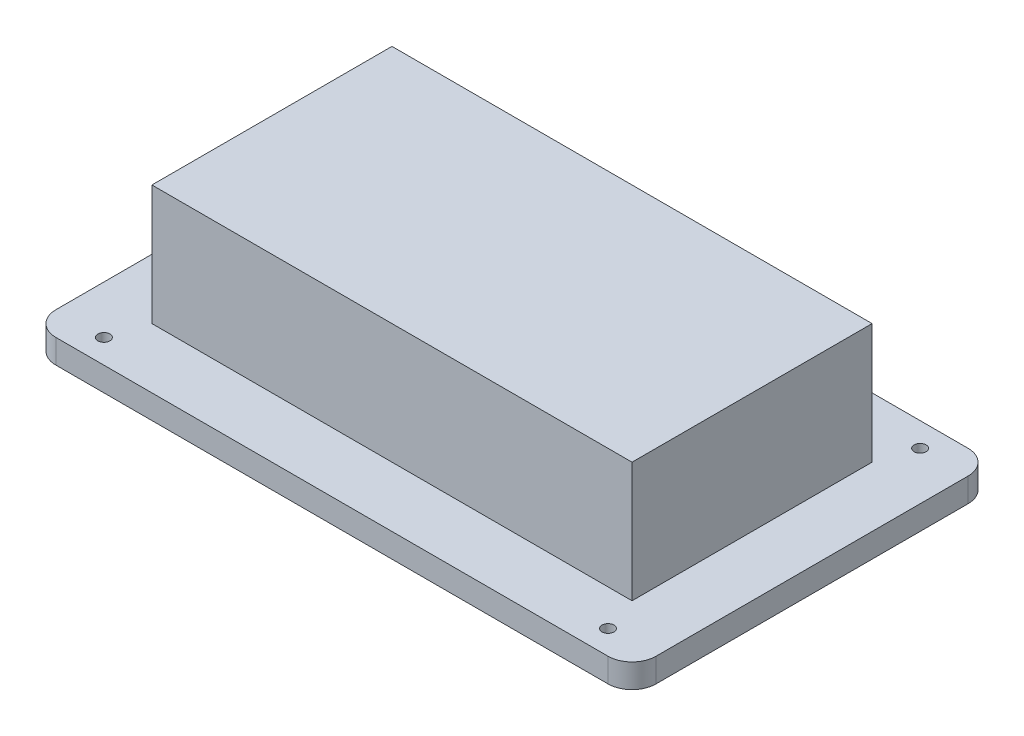
ISO-10303-21;
HEADER;
FILE_DESCRIPTION(('STEP AP214'),'2;1');
FILE_NAME('part.step','',(''),(''),'','','');
FILE_SCHEMA(('AUTOMOTIVE_DESIGN { 1 0 10303 214 1 1 1 1 }'));
ENDSEC;
DATA;
#1=APPLICATION_CONTEXT('core data for automotive mechanical design processes');
#2=APPLICATION_PROTOCOL_DEFINITION('international standard','automotive_design',2000,#1);
#3=PRODUCT_CONTEXT('',#1,'mechanical');
#4=PRODUCT('Part','Part','',(#3));
#5=PRODUCT_RELATED_PRODUCT_CATEGORY('part','',(#4));
#6=PRODUCT_DEFINITION_FORMATION('','',#4);
#7=PRODUCT_DEFINITION_CONTEXT('part definition',#1,'design');
#8=PRODUCT_DEFINITION('design','',#6,#7);
#9=PRODUCT_DEFINITION_SHAPE('','',#8);
#10=(LENGTH_UNIT() NAMED_UNIT(*) SI_UNIT(.MILLI.,.METRE.));
#11=(NAMED_UNIT(*) PLANE_ANGLE_UNIT() SI_UNIT($,.RADIAN.));
#12=(NAMED_UNIT(*) SI_UNIT($,.STERADIAN.) SOLID_ANGLE_UNIT());
#13=UNCERTAINTY_MEASURE_WITH_UNIT(LENGTH_MEASURE(1.E-05),#10,'distance_accuracy_value','');
#14=(GEOMETRIC_REPRESENTATION_CONTEXT(3) GLOBAL_UNCERTAINTY_ASSIGNED_CONTEXT((#13)) GLOBAL_UNIT_ASSIGNED_CONTEXT((#10,
#11,#12)) REPRESENTATION_CONTEXT('',''));
#15=CARTESIAN_POINT('',(0.,0.,0.));
#16=DIRECTION('',(0.,0.,1.));
#17=DIRECTION('',(1.,0.,0.));
#18=AXIS2_PLACEMENT_3D('',#15,#16,#17);
#19=CARTESIAN_POINT('',(125.,9.99999999999995,-75.0000000000001));
#20=DIRECTION('',(-1.,0.,0.));
#21=DIRECTION('',(0.,0.,1.));
#22=AXIS2_PLACEMENT_3D('',#19,#20,#21);
#23=PLANE('',#22);
#24=DIRECTION('',(0.,0.,-1.));
#25=VECTOR('',#24,1.);
#26=CARTESIAN_POINT('',(125.,0.,-75.));
#27=LINE('',#26,#25);
#28=CARTESIAN_POINT('',(125.,0.,64.9999999999953));
#29=VERTEX_POINT('',#28);
#30=CARTESIAN_POINT('',(125.,0.,-64.9999999999999));
#31=VERTEX_POINT('',#30);
#32=EDGE_CURVE('E159',#29,#31,#27,.T.);
#33=ORIENTED_EDGE('',*,*,#32,.T.);
#34=DIRECTION('',(0.,-1.,0.));
#35=VECTOR('',#34,1.);
#36=CARTESIAN_POINT('',(125.,10.,-65.0000000000001));
#37=LINE('',#36,#35);
#38=CARTESIAN_POINT('',(125.,10.,-65.0000000000001));
#39=VERTEX_POINT('',#38);
#40=EDGE_CURVE('E240',#31,#39,#37,.F.);
#41=ORIENTED_EDGE('',*,*,#40,.T.);
#42=DIRECTION('',(0.,0.,-1.));
#43=VECTOR('',#42,1.);
#44=CARTESIAN_POINT('',(125.,9.99999999999995,-75.0000000000001));
#45=LINE('',#44,#43);
#46=CARTESIAN_POINT('',(125.,10.,64.9999999999955));
#47=VERTEX_POINT('',#46);
#48=EDGE_CURVE('E171',#47,#39,#45,.T.);
#49=ORIENTED_EDGE('',*,*,#48,.F.);
#50=DIRECTION('',(0.,-1.,0.));
#51=VECTOR('',#50,1.);
#52=CARTESIAN_POINT('',(125.,10.,64.9999999999955));
#53=LINE('',#52,#51);
#54=EDGE_CURVE('E236',#47,#29,#53,.T.);
#55=ORIENTED_EDGE('',*,*,#54,.T.);
#56=EDGE_LOOP('',(#33,#41,#49,#55));
#57=FACE_BOUND('',#56,.T.);
#58=ADVANCED_FACE('F45',(#57),#23,.F.);
#59=CARTESIAN_POINT('',(-124.999999999999,10.,-75.0000000000024));
#60=DIRECTION('',(0.,0.,1.));
#61=DIRECTION('',(1.,0.,0.));
#62=AXIS2_PLACEMENT_3D('',#59,#60,#61);
#63=PLANE('',#62);
#64=DIRECTION('',(-1.,0.,0.));
#65=VECTOR('',#64,1.);
#66=CARTESIAN_POINT('',(-125.,0.,-75.0000000000001));
#67=LINE('',#66,#65);
#68=CARTESIAN_POINT('',(115.,0.,-75.0000000000001));
#69=VERTEX_POINT('',#68);
#70=CARTESIAN_POINT('',(-115.,0.,-75.));
#71=VERTEX_POINT('',#70);
#72=EDGE_CURVE('E165',#69,#71,#67,.T.);
#73=ORIENTED_EDGE('',*,*,#72,.T.);
#74=DIRECTION('',(0.,-1.,0.));
#75=VECTOR('',#74,1.);
#76=CARTESIAN_POINT('',(-114.999999999999,10.,-75.0000000000003));
#77=LINE('',#76,#75);
#78=CARTESIAN_POINT('',(-114.999999999999,10.,-75.0000000000003));
#79=VERTEX_POINT('',#78);
#80=EDGE_CURVE('E221',#71,#79,#77,.F.);
#81=ORIENTED_EDGE('',*,*,#80,.T.);
#82=DIRECTION('',(-1.,0.,0.));
#83=VECTOR('',#82,1.);
#84=CARTESIAN_POINT('',(-124.999999999999,10.,-75.0000000000024));
#85=LINE('',#84,#83);
#86=CARTESIAN_POINT('',(115.,10.,-75.0000000000024));
#87=VERTEX_POINT('',#86);
#88=EDGE_CURVE('E175',#87,#79,#85,.T.);
#89=ORIENTED_EDGE('',*,*,#88,.F.);
#90=DIRECTION('',(0.,-1.,0.));
#91=VECTOR('',#90,1.);
#92=CARTESIAN_POINT('',(115.,10.,-75.0000000000024));
#93=LINE('',#92,#91);
#94=EDGE_CURVE('E217',#87,#69,#93,.T.);
#95=ORIENTED_EDGE('',*,*,#94,.T.);
#96=EDGE_LOOP('',(#73,#81,#89,#95));
#97=FACE_BOUND('',#96,.T.);
#98=ADVANCED_FACE('F329',(#97),#63,.F.);
#99=CARTESIAN_POINT('',(-124.999999999999,10.,-75.0000000000024));
#100=DIRECTION('',(1.,0.,0.));
#101=DIRECTION('',(0.,0.,-1.));
#102=AXIS2_PLACEMENT_3D('',#99,#100,#101);
#103=PLANE('',#102);
#104=DIRECTION('',(0.,0.,1.));
#105=VECTOR('',#104,1.);
#106=CARTESIAN_POINT('',(-124.999999999999,10.,-75.0000000000024));
#107=LINE('',#106,#105);
#108=CARTESIAN_POINT('',(-124.999999999999,10.,-65.0000000000024));
#109=VERTEX_POINT('',#108);
#110=CARTESIAN_POINT('',(-125.,10.,65.0000000000002));
#111=VERTEX_POINT('',#110);
#112=EDGE_CURVE('E180',#109,#111,#107,.T.);
#113=ORIENTED_EDGE('',*,*,#112,.F.);
#114=DIRECTION('',(0.,-1.,0.));
#115=VECTOR('',#114,1.);
#116=CARTESIAN_POINT('',(-124.999999999999,10.,-65.0000000000024));
#117=LINE('',#116,#115);
#118=CARTESIAN_POINT('',(-125.,0.,-65.0000000000001));
#119=VERTEX_POINT('',#118);
#120=EDGE_CURVE('E201',#109,#119,#117,.T.);
#121=ORIENTED_EDGE('',*,*,#120,.T.);
#122=DIRECTION('',(0.,0.,1.));
#123=VECTOR('',#122,1.);
#124=CARTESIAN_POINT('',(-125.,0.,-75.0000000000001));
#125=LINE('',#124,#123);
#126=CARTESIAN_POINT('',(-125.,0.,64.9999999999997));
#127=VERTEX_POINT('',#126);
#128=EDGE_CURVE('E192',#119,#127,#125,.T.);
#129=ORIENTED_EDGE('',*,*,#128,.T.);
#130=DIRECTION('',(0.,-1.,0.));
#131=VECTOR('',#130,1.);
#132=CARTESIAN_POINT('',(-125.,10.,65.0000000000002));
#133=LINE('',#132,#131);
#134=EDGE_CURVE('E187',#127,#111,#133,.F.);
#135=ORIENTED_EDGE('',*,*,#134,.T.);
#136=EDGE_LOOP('',(#113,#121,#129,#135));
#137=FACE_BOUND('',#136,.T.);
#138=ADVANCED_FACE('F308',(#137),#103,.F.);
#139=CARTESIAN_POINT('',(-125.,9.9999999999999,75.));
#140=DIRECTION('',(0.,0.,-1.));
#141=DIRECTION('',(-1.,0.,0.));
#142=AXIS2_PLACEMENT_3D('',#139,#140,#141);
#143=PLANE('',#142);
#144=DIRECTION('',(1.,0.,0.));
#145=VECTOR('',#144,1.);
#146=CARTESIAN_POINT('',(-125.,-1.22124532708767E-12,74.9999999999997));
#147=LINE('',#146,#145);
#148=CARTESIAN_POINT('',(-115.,0.,74.9999999999953));
#149=VERTEX_POINT('',#148);
#150=CARTESIAN_POINT('',(115.,0.,74.9999999999997));
#151=VERTEX_POINT('',#150);
#152=EDGE_CURVE('E176',#149,#151,#147,.T.);
#153=ORIENTED_EDGE('',*,*,#152,.T.);
#154=DIRECTION('',(0.,-1.,0.));
#155=VECTOR('',#154,1.);
#156=CARTESIAN_POINT('',(115.,10.,75.0000000000002));
#157=LINE('',#156,#155);
#158=CARTESIAN_POINT('',(115.,10.,75.0000000000002));
#159=VERTEX_POINT('',#158);
#160=EDGE_CURVE('E11',#151,#159,#157,.F.);
#161=ORIENTED_EDGE('',*,*,#160,.T.);
#162=DIRECTION('',(1.,0.,0.));
#163=VECTOR('',#162,1.);
#164=CARTESIAN_POINT('',(-125.,9.9999999999999,75.));
#165=LINE('',#164,#163);
#166=CARTESIAN_POINT('',(-114.999999999999,10.,74.9999999999953));
#167=VERTEX_POINT('',#166);
#168=EDGE_CURVE('E184',#167,#159,#165,.T.);
#169=ORIENTED_EDGE('',*,*,#168,.F.);
#170=DIRECTION('',(0.,-1.,0.));
#171=VECTOR('',#170,1.);
#172=CARTESIAN_POINT('',(-114.999999999999,10.,74.9999999999953));
#173=LINE('',#172,#171);
#174=EDGE_CURVE('E55',#167,#149,#173,.T.);
#175=ORIENTED_EDGE('',*,*,#174,.T.);
#176=EDGE_LOOP('',(#153,#161,#169,#175));
#177=FACE_BOUND('',#176,.T.);
#178=ADVANCED_FACE('F293',(#177),#143,.F.);
#179=CARTESIAN_POINT('',(0.,10.,-2.44249065417534E-12));
#180=DIRECTION('',(0.,1.,0.));
#181=DIRECTION('',(0.,0.,1.));
#182=AXIS2_PLACEMENT_3D('',#179,#180,#181);
#183=PLANE('',#182);
#184=CARTESIAN_POINT('',(105.,10.,-65.0000000000004));
#185=DIRECTION('',(0.,1.,0.));
#186=DIRECTION('',(0.,0.,1.));
#187=AXIS2_PLACEMENT_3D('',#184,#185,#186);
#188=CIRCLE('',#187,2.49999999999999);
#189=CARTESIAN_POINT('',(105.,10.,-62.5000000000004));
#190=VERTEX_POINT('',#189);
#191=EDGE_CURVE('E493',#190,#190,#188,.T.);
#192=ORIENTED_EDGE('',*,*,#191,.F.);
#193=EDGE_LOOP('',(#192));
#194=FACE_BOUND('',#193,.T.);
#195=CARTESIAN_POINT('',(-104.999999999999,10.,-65.0000000000024));
#196=DIRECTION('',(0.,1.,0.));
#197=DIRECTION('',(0.,0.,1.));
#198=AXIS2_PLACEMENT_3D('',#195,#196,#197);
#199=CIRCLE('',#198,2.49999999999999);
#200=CARTESIAN_POINT('',(-104.999999999999,10.,-62.5000000000024));
#201=VERTEX_POINT('',#200);
#202=EDGE_CURVE('E497',#201,#201,#199,.T.);
#203=ORIENTED_EDGE('',*,*,#202,.F.);
#204=EDGE_LOOP('',(#203));
#205=FACE_BOUND('',#204,.T.);
#206=CARTESIAN_POINT('',(105.,10.,64.9999999999997));
#207=DIRECTION('',(0.,1.,0.));
#208=DIRECTION('',(0.,0.,1.));
#209=AXIS2_PLACEMENT_3D('',#206,#207,#208);
#210=CIRCLE('',#209,2.49999999999999);
#211=CARTESIAN_POINT('',(105.,10.,67.4999999999997));
#212=VERTEX_POINT('',#211);
#213=EDGE_CURVE('E264',#212,#212,#210,.T.);
#214=ORIENTED_EDGE('',*,*,#213,.F.);
#215=EDGE_LOOP('',(#214));
#216=FACE_BOUND('',#215,.T.);
#217=CARTESIAN_POINT('',(-104.999999999999,9.99999999999879,64.9999999999997));
#218=DIRECTION('',(0.,1.,0.));
#219=DIRECTION('',(0.,0.,1.));
#220=AXIS2_PLACEMENT_3D('',#217,#218,#219);
#221=CIRCLE('',#220,2.49999999999999);
#222=CARTESIAN_POINT('',(-104.999999999999,9.99999999999879,67.4999999999997));
#223=VERTEX_POINT('',#222);
#224=EDGE_CURVE('E248',#223,#223,#221,.T.);
#225=ORIENTED_EDGE('',*,*,#224,.F.);
#226=EDGE_LOOP('',(#225));
#227=FACE_BOUND('',#226,.T.);
#228=DIRECTION('',(0.,0.,-1.));
#229=VECTOR('',#228,1.);
#230=CARTESIAN_POINT('',(99.9999999999999,10.,49.9999999999996));
#231=LINE('',#230,#229);
#232=CARTESIAN_POINT('',(99.9999999999999,10.,49.9999999999996));
#233=VERTEX_POINT('',#232);
#234=CARTESIAN_POINT('',(99.9999999999999,10.,-50.0000000000024));
#235=VERTEX_POINT('',#234);
#236=EDGE_CURVE('E63',#233,#235,#231,.T.);
#237=ORIENTED_EDGE('',*,*,#236,.F.);
#238=DIRECTION('',(1.,0.,0.));
#239=VECTOR('',#238,1.);
#240=CARTESIAN_POINT('',(-100.,10.,49.9999999999996));
#241=LINE('',#240,#239);
#242=CARTESIAN_POINT('',(-100.,10.,49.9999999999996));
#243=VERTEX_POINT('',#242);
#244=EDGE_CURVE('E67',#243,#233,#241,.T.);
#245=ORIENTED_EDGE('',*,*,#244,.F.);
#246=DIRECTION('',(0.,0.,1.));
#247=VECTOR('',#246,1.);
#248=CARTESIAN_POINT('',(-100.,10.,49.9999999999996));
#249=LINE('',#248,#247);
#250=CARTESIAN_POINT('',(-100.,10.,-50.0000000000024));
#251=VERTEX_POINT('',#250);
#252=EDGE_CURVE('E275',#251,#243,#249,.T.);
#253=ORIENTED_EDGE('',*,*,#252,.F.);
#254=DIRECTION('',(-1.,0.,0.));
#255=VECTOR('',#254,1.);
#256=CARTESIAN_POINT('',(-100.,10.,-50.0000000000024));
#257=LINE('',#256,#255);
#258=EDGE_CURVE('E254',#235,#251,#257,.T.);
#259=ORIENTED_EDGE('',*,*,#258,.F.);
#260=EDGE_LOOP('',(#237,#245,#253,#259));
#261=FACE_BOUND('',#260,.T.);
#262=ORIENTED_EDGE('',*,*,#88,.T.);
#263=CARTESIAN_POINT('',(-114.999999999999,9.99999999999879,-65.0000000000003));
#264=DIRECTION('',(0.,1.,0.));
#265=DIRECTION('',(0.,0.,1.));
#266=AXIS2_PLACEMENT_3D('',#263,#264,#265);
#267=CIRCLE('',#266,10.);
#268=EDGE_CURVE('E233',#79,#109,#267,.T.);
#269=ORIENTED_EDGE('',*,*,#268,.T.);
#270=ORIENTED_EDGE('',*,*,#112,.T.);
#271=CARTESIAN_POINT('',(-114.999999999999,10.,64.9999999999955));
#272=DIRECTION('',(0.,1.,0.));
#273=DIRECTION('',(0.,0.,1.));
#274=AXIS2_PLACEMENT_3D('',#271,#272,#273);
#275=CIRCLE('',#274,10.);
#276=EDGE_CURVE('E224',#111,#167,#275,.T.);
#277=ORIENTED_EDGE('',*,*,#276,.T.);
#278=ORIENTED_EDGE('',*,*,#168,.T.);
#279=CARTESIAN_POINT('',(115.,10.,65.0000000000002));
#280=DIRECTION('',(0.,1.,0.));
#281=DIRECTION('',(0.,0.,1.));
#282=AXIS2_PLACEMENT_3D('',#279,#280,#281);
#283=CIRCLE('',#282,10.);
#284=EDGE_CURVE('E227',#159,#47,#283,.T.);
#285=ORIENTED_EDGE('',*,*,#284,.T.);
#286=ORIENTED_EDGE('',*,*,#48,.T.);
#287=CARTESIAN_POINT('',(115.,9.99999999999879,-65.0000000000024));
#288=DIRECTION('',(0.,1.,0.));
#289=DIRECTION('',(0.,0.,1.));
#290=AXIS2_PLACEMENT_3D('',#287,#288,#289);
#291=CIRCLE('',#290,10.);
#292=EDGE_CURVE('E230',#39,#87,#291,.T.);
#293=ORIENTED_EDGE('',*,*,#292,.T.);
#294=EDGE_LOOP('',(#262,#269,#270,#277,#278,#285,#286,#293));
#295=FACE_BOUND('',#294,.T.);
#296=ADVANCED_FACE('F289',(#194,#205,#216,#227,#261,#295),#183,.T.);
#297=CARTESIAN_POINT('',(0.,0.,0.));
#298=DIRECTION('',(0.,1.,0.));
#299=DIRECTION('',(0.,0.,1.));
#300=AXIS2_PLACEMENT_3D('',#297,#298,#299);
#301=PLANE('',#300);
#302=CARTESIAN_POINT('',(105.,0.,-64.9999999999999));
#303=DIRECTION('',(0.,1.,0.));
#304=DIRECTION('',(0.,0.,1.));
#305=AXIS2_PLACEMENT_3D('',#302,#303,#304);
#306=CIRCLE('',#305,2.49999999999999);
#307=CARTESIAN_POINT('',(105.,0.,-62.5));
#308=VERTEX_POINT('',#307);
#309=EDGE_CURVE('E49',#308,#308,#306,.T.);
#310=ORIENTED_EDGE('',*,*,#309,.T.);
#311=EDGE_LOOP('',(#310));
#312=FACE_BOUND('',#311,.T.);
#313=CARTESIAN_POINT('',(-105.,0.,-65.0000000000001));
#314=DIRECTION('',(0.,1.,0.));
#315=DIRECTION('',(0.,0.,1.));
#316=AXIS2_PLACEMENT_3D('',#313,#314,#315);
#317=CIRCLE('',#316,2.49999999999999);
#318=CARTESIAN_POINT('',(-105.,0.,-62.5000000000001));
#319=VERTEX_POINT('',#318);
#320=EDGE_CURVE('E502',#319,#319,#317,.T.);
#321=ORIENTED_EDGE('',*,*,#320,.T.);
#322=EDGE_LOOP('',(#321));
#323=FACE_BOUND('',#322,.T.);
#324=CARTESIAN_POINT('',(105.,0.,64.9999999999997));
#325=DIRECTION('',(0.,1.,0.));
#326=DIRECTION('',(0.,0.,1.));
#327=AXIS2_PLACEMENT_3D('',#324,#325,#326);
#328=CIRCLE('',#327,2.49999999999999);
#329=CARTESIAN_POINT('',(105.,0.,67.4999999999997));
#330=VERTEX_POINT('',#329);
#331=EDGE_CURVE('E257',#330,#330,#328,.T.);
#332=ORIENTED_EDGE('',*,*,#331,.T.);
#333=EDGE_LOOP('',(#332));
#334=FACE_BOUND('',#333,.T.);
#335=CARTESIAN_POINT('',(-105.,-1.22124532708767E-12,64.9999999999953));
#336=DIRECTION('',(0.,1.,0.));
#337=DIRECTION('',(0.,0.,1.));
#338=AXIS2_PLACEMENT_3D('',#335,#336,#337);
#339=CIRCLE('',#338,2.49999999999999);
#340=CARTESIAN_POINT('',(-105.,-1.22124532708772E-12,67.4999999999953));
#341=VERTEX_POINT('',#340);
#342=EDGE_CURVE('E245',#341,#341,#339,.T.);
#343=ORIENTED_EDGE('',*,*,#342,.T.);
#344=EDGE_LOOP('',(#343));
#345=FACE_BOUND('',#344,.T.);
#346=ORIENTED_EDGE('',*,*,#128,.F.);
#347=CARTESIAN_POINT('',(-115.,-1.22124532708767E-12,-64.9999999999999));
#348=DIRECTION('',(0.,1.,0.));
#349=DIRECTION('',(0.,0.,1.));
#350=AXIS2_PLACEMENT_3D('',#347,#348,#349);
#351=CIRCLE('',#350,10.);
#352=EDGE_CURVE('E214',#119,#71,#351,.F.);
#353=ORIENTED_EDGE('',*,*,#352,.T.);
#354=ORIENTED_EDGE('',*,*,#72,.F.);
#355=CARTESIAN_POINT('',(115.,-1.22124532708767E-12,-65.0000000000001));
#356=DIRECTION('',(0.,1.,0.));
#357=DIRECTION('',(0.,0.,1.));
#358=AXIS2_PLACEMENT_3D('',#355,#356,#357);
#359=CIRCLE('',#358,10.);
#360=EDGE_CURVE('E211',#69,#31,#359,.F.);
#361=ORIENTED_EDGE('',*,*,#360,.T.);
#362=ORIENTED_EDGE('',*,*,#32,.F.);
#363=CARTESIAN_POINT('',(115.,0.,64.9999999999997));
#364=DIRECTION('',(0.,1.,0.));
#365=DIRECTION('',(0.,0.,1.));
#366=AXIS2_PLACEMENT_3D('',#363,#364,#365);
#367=CIRCLE('',#366,10.);
#368=EDGE_CURVE('E208',#29,#151,#367,.F.);
#369=ORIENTED_EDGE('',*,*,#368,.T.);
#370=ORIENTED_EDGE('',*,*,#152,.F.);
#371=CARTESIAN_POINT('',(-115.,0.,64.9999999999953));
#372=DIRECTION('',(0.,1.,0.));
#373=DIRECTION('',(0.,0.,1.));
#374=AXIS2_PLACEMENT_3D('',#371,#372,#373);
#375=CIRCLE('',#374,10.);
#376=EDGE_CURVE('E205',#149,#127,#375,.F.);
#377=ORIENTED_EDGE('',*,*,#376,.T.);
#378=EDGE_LOOP('',(#346,#353,#354,#361,#362,#369,#370,#377));
#379=FACE_BOUND('',#378,.T.);
#380=ADVANCED_FACE('F292',(#312,#323,#334,#345,#379),#301,.F.);
#381=CARTESIAN_POINT('',(-114.999999999999,9.99999999999879,-65.0000000000003));
#382=DIRECTION('',(0.,-1.,0.));
#383=DIRECTION('',(0.,0.,-1.));
#384=AXIS2_PLACEMENT_3D('',#381,#382,#383);
#385=CYLINDRICAL_SURFACE('',#384,10.);
#386=ORIENTED_EDGE('',*,*,#268,.F.);
#387=ORIENTED_EDGE('',*,*,#80,.F.);
#388=ORIENTED_EDGE('',*,*,#352,.F.);
#389=ORIENTED_EDGE('',*,*,#120,.F.);
#390=EDGE_LOOP('',(#386,#387,#388,#389));
#391=FACE_BOUND('',#390,.T.);
#392=ADVANCED_FACE('F305',(#391),#385,.T.);
#393=CARTESIAN_POINT('',(115.,9.99999999999879,-65.0000000000024));
#394=DIRECTION('',(0.,-1.,0.));
#395=DIRECTION('',(0.,0.,-1.));
#396=AXIS2_PLACEMENT_3D('',#393,#394,#395);
#397=CYLINDRICAL_SURFACE('',#396,10.);
#398=ORIENTED_EDGE('',*,*,#292,.F.);
#399=ORIENTED_EDGE('',*,*,#40,.F.);
#400=ORIENTED_EDGE('',*,*,#360,.F.);
#401=ORIENTED_EDGE('',*,*,#94,.F.);
#402=EDGE_LOOP('',(#398,#399,#400,#401));
#403=FACE_BOUND('',#402,.T.);
#404=ADVANCED_FACE('F328',(#403),#397,.T.);
#405=CARTESIAN_POINT('',(115.,10.,65.0000000000002));
#406=DIRECTION('',(0.,-1.,0.));
#407=DIRECTION('',(0.,0.,-1.));
#408=AXIS2_PLACEMENT_3D('',#405,#406,#407);
#409=CYLINDRICAL_SURFACE('',#408,10.);
#410=ORIENTED_EDGE('',*,*,#284,.F.);
#411=ORIENTED_EDGE('',*,*,#160,.F.);
#412=ORIENTED_EDGE('',*,*,#368,.F.);
#413=ORIENTED_EDGE('',*,*,#54,.F.);
#414=EDGE_LOOP('',(#410,#411,#412,#413));
#415=FACE_BOUND('',#414,.T.);
#416=ADVANCED_FACE('F323',(#415),#409,.T.);
#417=CARTESIAN_POINT('',(-114.999999999999,10.,64.9999999999955));
#418=DIRECTION('',(0.,-1.,0.));
#419=DIRECTION('',(0.,0.,-1.));
#420=AXIS2_PLACEMENT_3D('',#417,#418,#419);
#421=CYLINDRICAL_SURFACE('',#420,10.);
#422=ORIENTED_EDGE('',*,*,#276,.F.);
#423=ORIENTED_EDGE('',*,*,#134,.F.);
#424=ORIENTED_EDGE('',*,*,#376,.F.);
#425=ORIENTED_EDGE('',*,*,#174,.F.);
#426=EDGE_LOOP('',(#422,#423,#424,#425));
#427=FACE_BOUND('',#426,.T.);
#428=ADVANCED_FACE('F47',(#427),#421,.T.);
#429=CARTESIAN_POINT('',(100.,60.,50.0000000000003));
#430=DIRECTION('',(-1.,0.,0.));
#431=DIRECTION('',(0.,0.,1.));
#432=AXIS2_PLACEMENT_3D('',#429,#430,#431);
#433=PLANE('',#432);
#434=ORIENTED_EDGE('',*,*,#236,.T.);
#435=DIRECTION('',(0.,-1.,0.));
#436=VECTOR('',#435,1.);
#437=CARTESIAN_POINT('',(100.,60.,-50.));
#438=LINE('',#437,#436);
#439=CARTESIAN_POINT('',(100.,60.,-50.));
#440=VERTEX_POINT('',#439);
#441=EDGE_CURVE('E139',#440,#235,#438,.T.);
#442=ORIENTED_EDGE('',*,*,#441,.F.);
#443=DIRECTION('',(0.,0.,-1.));
#444=VECTOR('',#443,1.);
#445=CARTESIAN_POINT('',(100.,60.,50.0000000000003));
#446=LINE('',#445,#444);
#447=CARTESIAN_POINT('',(100.,60.,50.0000000000003));
#448=VERTEX_POINT('',#447);
#449=EDGE_CURVE('E146',#448,#440,#446,.T.);
#450=ORIENTED_EDGE('',*,*,#449,.F.);
#451=DIRECTION('',(0.,-1.,0.));
#452=VECTOR('',#451,1.);
#453=CARTESIAN_POINT('',(100.,60.,50.0000000000003));
#454=LINE('',#453,#452);
#455=EDGE_CURVE('E271',#448,#233,#454,.T.);
#456=ORIENTED_EDGE('',*,*,#455,.T.);
#457=EDGE_LOOP('',(#434,#442,#450,#456));
#458=FACE_BOUND('',#457,.T.);
#459=ADVANCED_FACE('F157',(#458),#433,.F.);
#460=CARTESIAN_POINT('',(-100.,60.,-50.0000000000004));
#461=DIRECTION('',(0.,0.,1.));
#462=DIRECTION('',(1.,0.,0.));
#463=AXIS2_PLACEMENT_3D('',#460,#461,#462);
#464=PLANE('',#463);
#465=ORIENTED_EDGE('',*,*,#258,.T.);
#466=DIRECTION('',(0.,-1.,0.));
#467=VECTOR('',#466,1.);
#468=CARTESIAN_POINT('',(-100.,60.,-50.0000000000004));
#469=LINE('',#468,#467);
#470=CARTESIAN_POINT('',(-100.,60.,-50.0000000000004));
#471=VERTEX_POINT('',#470);
#472=EDGE_CURVE('E141',#471,#251,#469,.T.);
#473=ORIENTED_EDGE('',*,*,#472,.F.);
#474=DIRECTION('',(-1.,0.,0.));
#475=VECTOR('',#474,1.);
#476=CARTESIAN_POINT('',(-100.,60.,-50.0000000000004));
#477=LINE('',#476,#475);
#478=EDGE_CURVE('E134',#440,#471,#477,.T.);
#479=ORIENTED_EDGE('',*,*,#478,.F.);
#480=ORIENTED_EDGE('',*,*,#441,.T.);
#481=EDGE_LOOP('',(#465,#473,#479,#480));
#482=FACE_BOUND('',#481,.T.);
#483=ADVANCED_FACE('F137',(#482),#464,.F.);
#484=CARTESIAN_POINT('',(-100.,60.,50.0000000000003));
#485=DIRECTION('',(1.,0.,0.));
#486=DIRECTION('',(0.,0.,-1.));
#487=AXIS2_PLACEMENT_3D('',#484,#485,#486);
#488=PLANE('',#487);
#489=ORIENTED_EDGE('',*,*,#252,.T.);
#490=DIRECTION('',(0.,-1.,0.));
#491=VECTOR('',#490,1.);
#492=CARTESIAN_POINT('',(-100.,60.,50.0000000000003));
#493=LINE('',#492,#491);
#494=CARTESIAN_POINT('',(-100.,60.,50.0000000000003));
#495=VERTEX_POINT('',#494);
#496=EDGE_CURVE('E167',#495,#243,#493,.T.);
#497=ORIENTED_EDGE('',*,*,#496,.F.);
#498=DIRECTION('',(0.,0.,1.));
#499=VECTOR('',#498,1.);
#500=CARTESIAN_POINT('',(-100.,60.,50.0000000000003));
#501=LINE('',#500,#499);
#502=EDGE_CURVE('E145',#471,#495,#501,.T.);
#503=ORIENTED_EDGE('',*,*,#502,.F.);
#504=ORIENTED_EDGE('',*,*,#472,.T.);
#505=EDGE_LOOP('',(#489,#497,#503,#504));
#506=FACE_BOUND('',#505,.T.);
#507=ADVANCED_FACE('F288',(#506),#488,.F.);
#508=CARTESIAN_POINT('',(-100.,60.,50.0000000000003));
#509=DIRECTION('',(0.,0.,-1.));
#510=DIRECTION('',(-1.,0.,0.));
#511=AXIS2_PLACEMENT_3D('',#508,#509,#510);
#512=PLANE('',#511);
#513=ORIENTED_EDGE('',*,*,#244,.T.);
#514=ORIENTED_EDGE('',*,*,#455,.F.);
#515=DIRECTION('',(1.,0.,0.));
#516=VECTOR('',#515,1.);
#517=CARTESIAN_POINT('',(-100.,60.,50.0000000000003));
#518=LINE('',#517,#516);
#519=EDGE_CURVE('E151',#495,#448,#518,.T.);
#520=ORIENTED_EDGE('',*,*,#519,.F.);
#521=ORIENTED_EDGE('',*,*,#496,.T.);
#522=EDGE_LOOP('',(#513,#514,#520,#521));
#523=FACE_BOUND('',#522,.T.);
#524=ADVANCED_FACE('F286',(#523),#512,.F.);
#525=CARTESIAN_POINT('',(0.,60.,0.));
#526=DIRECTION('',(0.,-1.,0.));
#527=DIRECTION('',(0.,0.,-1.));
#528=AXIS2_PLACEMENT_3D('',#525,#526,#527);
#529=PLANE('',#528);
#530=ORIENTED_EDGE('',*,*,#449,.T.);
#531=ORIENTED_EDGE('',*,*,#478,.T.);
#532=ORIENTED_EDGE('',*,*,#502,.T.);
#533=ORIENTED_EDGE('',*,*,#519,.T.);
#534=EDGE_LOOP('',(#530,#531,#532,#533));
#535=FACE_BOUND('',#534,.T.);
#536=ADVANCED_FACE('F149',(#535),#529,.F.);
#537=CARTESIAN_POINT('',(-104.999999999999,9.99999999999879,64.9999999999997));
#538=DIRECTION('',(0.,1.,0.));
#539=DIRECTION('',(0.,0.,1.));
#540=AXIS2_PLACEMENT_3D('',#537,#538,#539);
#541=CYLINDRICAL_SURFACE('',#540,2.49999999999999);
#542=ORIENTED_EDGE('',*,*,#224,.T.);
#543=EDGE_LOOP('',(#542));
#544=FACE_BOUND('',#543,.T.);
#545=ORIENTED_EDGE('',*,*,#342,.F.);
#546=EDGE_LOOP('',(#545));
#547=FACE_BOUND('',#546,.T.);
#548=ADVANCED_FACE('F417',(#544,#547),#541,.F.);
#549=CARTESIAN_POINT('',(105.,10.,64.9999999999997));
#550=DIRECTION('',(0.,1.,0.));
#551=DIRECTION('',(0.,0.,1.));
#552=AXIS2_PLACEMENT_3D('',#549,#550,#551);
#553=CYLINDRICAL_SURFACE('',#552,2.49999999999999);
#554=ORIENTED_EDGE('',*,*,#213,.T.);
#555=EDGE_LOOP('',(#554));
#556=FACE_BOUND('',#555,.T.);
#557=ORIENTED_EDGE('',*,*,#331,.F.);
#558=EDGE_LOOP('',(#557));
#559=FACE_BOUND('',#558,.T.);
#560=ADVANCED_FACE('F425',(#556,#559),#553,.F.);
#561=CARTESIAN_POINT('',(-104.999999999999,10.,-65.0000000000024));
#562=DIRECTION('',(0.,1.,0.));
#563=DIRECTION('',(0.,0.,1.));
#564=AXIS2_PLACEMENT_3D('',#561,#562,#563);
#565=CYLINDRICAL_SURFACE('',#564,2.49999999999999);
#566=ORIENTED_EDGE('',*,*,#202,.T.);
#567=EDGE_LOOP('',(#566));
#568=FACE_BOUND('',#567,.T.);
#569=ORIENTED_EDGE('',*,*,#320,.F.);
#570=EDGE_LOOP('',(#569));
#571=FACE_BOUND('',#570,.T.);
#572=ADVANCED_FACE('F433',(#568,#571),#565,.F.);
#573=CARTESIAN_POINT('',(105.,10.,-65.0000000000004));
#574=DIRECTION('',(0.,1.,0.));
#575=DIRECTION('',(0.,0.,1.));
#576=AXIS2_PLACEMENT_3D('',#573,#574,#575);
#577=CYLINDRICAL_SURFACE('',#576,2.49999999999999);
#578=ORIENTED_EDGE('',*,*,#191,.T.);
#579=EDGE_LOOP('',(#578));
#580=FACE_BOUND('',#579,.T.);
#581=ORIENTED_EDGE('',*,*,#309,.F.);
#582=EDGE_LOOP('',(#581));
#583=FACE_BOUND('',#582,.T.);
#584=ADVANCED_FACE('F443',(#580,#583),#577,.F.);
#585=CLOSED_SHELL('',(#58,#98,#138,#178,#296,#380,#392,#404,#416,#428,#459,#483,#507,#524,#536,
#548,#560,#572,#584));
#586=MANIFOLD_SOLID_BREP('B2',#585);
#587=ADVANCED_BREP_SHAPE_REPRESENTATION('',(#18,#586),#14);
#588=SHAPE_DEFINITION_REPRESENTATION(#9,#587);
ENDSEC;
END-ISO-10303-21;
